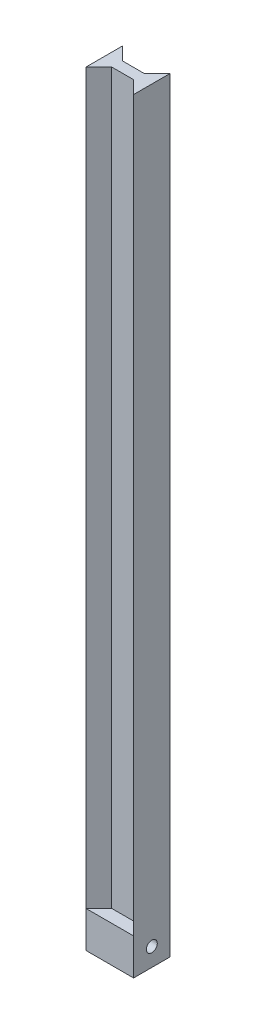
ISO-10303-21;
HEADER;
FILE_DESCRIPTION(('STEP AP214'),'2;1');
FILE_NAME('part.step','',(''),(''),'','','');
FILE_SCHEMA(('AUTOMOTIVE_DESIGN { 1 0 10303 214 1 1 1 1 }'));
ENDSEC;
DATA;
#1=APPLICATION_CONTEXT('core data for automotive mechanical design processes');
#2=APPLICATION_PROTOCOL_DEFINITION('international standard','automotive_design',2000,#1);
#3=PRODUCT_CONTEXT('',#1,'mechanical');
#4=PRODUCT('Part','Part','',(#3));
#5=PRODUCT_RELATED_PRODUCT_CATEGORY('part','',(#4));
#6=PRODUCT_DEFINITION_FORMATION('','',#4);
#7=PRODUCT_DEFINITION_CONTEXT('part definition',#1,'design');
#8=PRODUCT_DEFINITION('design','',#6,#7);
#9=PRODUCT_DEFINITION_SHAPE('','',#8);
#10=(LENGTH_UNIT() NAMED_UNIT(*) SI_UNIT(.MILLI.,.METRE.));
#11=(NAMED_UNIT(*) PLANE_ANGLE_UNIT() SI_UNIT($,.RADIAN.));
#12=(NAMED_UNIT(*) SI_UNIT($,.STERADIAN.) SOLID_ANGLE_UNIT());
#13=UNCERTAINTY_MEASURE_WITH_UNIT(LENGTH_MEASURE(1.E-05),#10,'distance_accuracy_value','');
#14=(GEOMETRIC_REPRESENTATION_CONTEXT(3) GLOBAL_UNCERTAINTY_ASSIGNED_CONTEXT((#13)) GLOBAL_UNIT_ASSIGNED_CONTEXT((#10,
#11,#12)) REPRESENTATION_CONTEXT('',''));
#15=CARTESIAN_POINT('',(0.,0.,0.));
#16=DIRECTION('',(0.,0.,1.));
#17=DIRECTION('',(1.,0.,0.));
#18=AXIS2_PLACEMENT_3D('',#15,#16,#17);
#19=CARTESIAN_POINT('',(0.,200.,9.99999999999999));
#20=DIRECTION('',(-1.,0.,0.));
#21=DIRECTION('',(0.,0.,1.));
#22=AXIS2_PLACEMENT_3D('',#19,#20,#21);
#23=PLANE('',#22);
#24=CARTESIAN_POINT('',(0.,-5.,5.));
#25=DIRECTION('',(-1.,0.,0.));
#26=DIRECTION('',(0.,0.,1.));
#27=AXIS2_PLACEMENT_3D('',#24,#25,#26);
#28=CIRCLE('',#27,1.5);
#29=CARTESIAN_POINT('',(0.,-5.,6.5));
#30=VERTEX_POINT('',#29);
#31=EDGE_CURVE('E242',#30,#30,#28,.T.);
#32=ORIENTED_EDGE('',*,*,#31,.T.);
#33=EDGE_LOOP('',(#32));
#34=FACE_BOUND('',#33,.T.);
#35=DIRECTION('',(0.,-1.,0.));
#36=VECTOR('',#35,1.);
#37=CARTESIAN_POINT('',(0.,200.,9.99999999999999));
#38=LINE('',#37,#36);
#39=CARTESIAN_POINT('',(0.,200.,9.99999999999999));
#40=VERTEX_POINT('',#39);
#41=CARTESIAN_POINT('',(0.,0.,10.));
#42=VERTEX_POINT('',#41);
#43=EDGE_CURVE('E138',#40,#42,#38,.T.);
#44=ORIENTED_EDGE('',*,*,#43,.T.);
#45=DIRECTION('',(0.,1.,0.));
#46=VECTOR('',#45,1.);
#47=CARTESIAN_POINT('',(0.,-10.,10.));
#48=LINE('',#47,#46);
#49=CARTESIAN_POINT('',(0.,-10.,10.));
#50=VERTEX_POINT('',#49);
#51=EDGE_CURVE('E116',#50,#42,#48,.T.);
#52=ORIENTED_EDGE('',*,*,#51,.F.);
#53=DIRECTION('',(0.,0.,1.));
#54=VECTOR('',#53,1.);
#55=CARTESIAN_POINT('',(0.,-10.,0.));
#56=LINE('',#55,#54);
#57=CARTESIAN_POINT('',(0.,-10.,0.));
#58=VERTEX_POINT('',#57);
#59=EDGE_CURVE('E124',#58,#50,#56,.T.);
#60=ORIENTED_EDGE('',*,*,#59,.F.);
#61=DIRECTION('',(0.,1.,0.));
#62=VECTOR('',#61,1.);
#63=CARTESIAN_POINT('',(0.,-10.,0.));
#64=LINE('',#63,#62);
#65=CARTESIAN_POINT('',(0.,0.,0.));
#66=VERTEX_POINT('',#65);
#67=EDGE_CURVE('E230',#58,#66,#64,.T.);
#68=ORIENTED_EDGE('',*,*,#67,.T.);
#69=DIRECTION('',(0.,-1.,0.));
#70=VECTOR('',#69,1.);
#71=CARTESIAN_POINT('',(0.,200.,0.));
#72=LINE('',#71,#70);
#73=CARTESIAN_POINT('',(0.,200.,0.));
#74=VERTEX_POINT('',#73);
#75=EDGE_CURVE('E11',#74,#66,#72,.T.);
#76=ORIENTED_EDGE('',*,*,#75,.F.);
#77=DIRECTION('',(0.,0.,-1.));
#78=VECTOR('',#77,1.);
#79=CARTESIAN_POINT('',(0.,200.,9.99999999999999));
#80=LINE('',#79,#78);
#81=EDGE_CURVE('E151',#40,#74,#80,.T.);
#82=ORIENTED_EDGE('',*,*,#81,.F.);
#83=EDGE_LOOP('',(#44,#52,#60,#68,#76,#82));
#84=FACE_BOUND('',#83,.T.);
#85=ADVANCED_FACE('F38',(#34,#84),#23,.F.);
#86=CARTESIAN_POINT('',(0.,200.,0.));
#87=DIRECTION('',(0.707106781186549,0.,0.707106781186546));
#88=DIRECTION('',(0.707106781186546,0.,-0.707106781186549));
#89=AXIS2_PLACEMENT_3D('',#86,#87,#88);
#90=PLANE('',#89);
#91=DIRECTION('',(-0.707106781186546,0.,0.70710678118655));
#92=VECTOR('',#91,1.);
#93=CARTESIAN_POINT('',(0.,0.,0.));
#94=LINE('',#93,#92);
#95=CARTESIAN_POINT('',(-3.53553390593273,0.,3.53553390593275));
#96=VERTEX_POINT('',#95);
#97=EDGE_CURVE('E140',#66,#96,#94,.T.);
#98=ORIENTED_EDGE('',*,*,#97,.T.);
#99=DIRECTION('',(0.,-1.,0.));
#100=VECTOR('',#99,1.);
#101=CARTESIAN_POINT('',(-3.53553390593273,200.,3.53553390593275));
#102=LINE('',#101,#100);
#103=CARTESIAN_POINT('',(-3.53553390593273,200.,3.53553390593275));
#104=VERTEX_POINT('',#103);
#105=EDGE_CURVE('E47',#104,#96,#102,.T.);
#106=ORIENTED_EDGE('',*,*,#105,.F.);
#107=DIRECTION('',(-0.707106781186546,0.,0.70710678118655));
#108=VECTOR('',#107,1.);
#109=CARTESIAN_POINT('',(0.,200.,0.));
#110=LINE('',#109,#108);
#111=EDGE_CURVE('E154',#74,#104,#110,.T.);
#112=ORIENTED_EDGE('',*,*,#111,.F.);
#113=ORIENTED_EDGE('',*,*,#75,.T.);
#114=EDGE_LOOP('',(#98,#106,#112,#113));
#115=FACE_BOUND('',#114,.T.);
#116=ADVANCED_FACE('F222',(#115),#90,.F.);
#117=CARTESIAN_POINT('',(-3.53553390593273,200.,3.53553390593275));
#118=DIRECTION('',(0.,0.,1.));
#119=DIRECTION('',(1.,0.,0.));
#120=AXIS2_PLACEMENT_3D('',#117,#118,#119);
#121=PLANE('',#120);
#122=DIRECTION('',(-1.,0.,0.));
#123=VECTOR('',#122,1.);
#124=CARTESIAN_POINT('',(-3.53553390593273,0.,3.53553390593275));
#125=LINE('',#124,#123);
#126=CARTESIAN_POINT('',(-9.53553390593273,0.,3.53553390593275));
#127=VERTEX_POINT('',#126);
#128=EDGE_CURVE('E145',#96,#127,#125,.T.);
#129=ORIENTED_EDGE('',*,*,#128,.T.);
#130=DIRECTION('',(0.,-1.,0.));
#131=VECTOR('',#130,1.);
#132=CARTESIAN_POINT('',(-9.53553390593273,200.,3.53553390593275));
#133=LINE('',#132,#131);
#134=CARTESIAN_POINT('',(-9.53553390593273,200.,3.53553390593275));
#135=VERTEX_POINT('',#134);
#136=EDGE_CURVE('E210',#135,#127,#133,.T.);
#137=ORIENTED_EDGE('',*,*,#136,.F.);
#138=DIRECTION('',(-1.,0.,0.));
#139=VECTOR('',#138,1.);
#140=CARTESIAN_POINT('',(-3.53553390593273,200.,3.53553390593275));
#141=LINE('',#140,#139);
#142=EDGE_CURVE('E158',#104,#135,#141,.T.);
#143=ORIENTED_EDGE('',*,*,#142,.F.);
#144=ORIENTED_EDGE('',*,*,#105,.T.);
#145=EDGE_LOOP('',(#129,#137,#143,#144));
#146=FACE_BOUND('',#145,.T.);
#147=ADVANCED_FACE('F218',(#146),#121,.F.);
#148=CARTESIAN_POINT('',(-9.53553390593273,200.,3.53553390593275));
#149=DIRECTION('',(-0.707106781186547,0.,0.707106781186548));
#150=DIRECTION('',(0.707106781186548,0.,0.707106781186547));
#151=AXIS2_PLACEMENT_3D('',#148,#149,#150);
#152=PLANE('',#151);
#153=DIRECTION('',(-0.707106781186548,0.,-0.707106781186547));
#154=VECTOR('',#153,1.);
#155=CARTESIAN_POINT('',(-9.53553390593273,0.,3.53553390593275));
#156=LINE('',#155,#154);
#157=CARTESIAN_POINT('',(-13.0710678118655,0.,0.));
#158=VERTEX_POINT('',#157);
#159=EDGE_CURVE('E178',#127,#158,#156,.T.);
#160=ORIENTED_EDGE('',*,*,#159,.T.);
#161=DIRECTION('',(0.,-1.,0.));
#162=VECTOR('',#161,1.);
#163=CARTESIAN_POINT('',(-13.0710678118655,200.,0.));
#164=LINE('',#163,#162);
#165=CARTESIAN_POINT('',(-13.0710678118655,200.,0.));
#166=VERTEX_POINT('',#165);
#167=EDGE_CURVE('E206',#166,#158,#164,.T.);
#168=ORIENTED_EDGE('',*,*,#167,.F.);
#169=DIRECTION('',(-0.707106781186548,0.,-0.707106781186547));
#170=VECTOR('',#169,1.);
#171=CARTESIAN_POINT('',(-9.53553390593273,200.,3.53553390593275));
#172=LINE('',#171,#170);
#173=EDGE_CURVE('E161',#135,#166,#172,.T.);
#174=ORIENTED_EDGE('',*,*,#173,.F.);
#175=ORIENTED_EDGE('',*,*,#136,.T.);
#176=EDGE_LOOP('',(#160,#168,#174,#175));
#177=FACE_BOUND('',#176,.T.);
#178=ADVANCED_FACE('F261',(#177),#152,.F.);
#179=CARTESIAN_POINT('',(-13.0710678118655,200.,0.));
#180=DIRECTION('',(1.,0.,0.));
#181=DIRECTION('',(0.,0.,-1.));
#182=AXIS2_PLACEMENT_3D('',#179,#180,#181);
#183=PLANE('',#182);
#184=CARTESIAN_POINT('',(-13.0710678118655,-5.,5.00000000000001));
#185=DIRECTION('',(-1.,0.,0.));
#186=DIRECTION('',(0.,0.,1.));
#187=AXIS2_PLACEMENT_3D('',#184,#185,#186);
#188=CIRCLE('',#187,1.5);
#189=CARTESIAN_POINT('',(-13.0710678118655,-5.,6.50000000000001));
#190=VERTEX_POINT('',#189);
#191=EDGE_CURVE('E249',#190,#190,#188,.T.);
#192=ORIENTED_EDGE('',*,*,#191,.F.);
#193=EDGE_LOOP('',(#192));
#194=FACE_BOUND('',#193,.T.);
#195=ORIENTED_EDGE('',*,*,#167,.T.);
#196=DIRECTION('',(0.,1.,0.));
#197=VECTOR('',#196,1.);
#198=CARTESIAN_POINT('',(-13.0710678118655,-10.,0.));
#199=LINE('',#198,#197);
#200=CARTESIAN_POINT('',(-13.0710678118655,-10.,0.));
#201=VERTEX_POINT('',#200);
#202=EDGE_CURVE('E147',#201,#158,#199,.T.);
#203=ORIENTED_EDGE('',*,*,#202,.F.);
#204=DIRECTION('',(0.,0.,-1.));
#205=VECTOR('',#204,1.);
#206=CARTESIAN_POINT('',(-13.0710678118655,-10.,0.));
#207=LINE('',#206,#205);
#208=CARTESIAN_POINT('',(-13.0710678118655,-10.,10.));
#209=VERTEX_POINT('',#208);
#210=EDGE_CURVE('E123',#209,#201,#207,.T.);
#211=ORIENTED_EDGE('',*,*,#210,.F.);
#212=DIRECTION('',(0.,1.,0.));
#213=VECTOR('',#212,1.);
#214=CARTESIAN_POINT('',(-13.0710678118655,-10.,10.));
#215=LINE('',#214,#213);
#216=CARTESIAN_POINT('',(-13.0710678118655,0.,10.));
#217=VERTEX_POINT('',#216);
#218=EDGE_CURVE('E119',#209,#217,#215,.T.);
#219=ORIENTED_EDGE('',*,*,#218,.T.);
#220=DIRECTION('',(0.,-1.,0.));
#221=VECTOR('',#220,1.);
#222=CARTESIAN_POINT('',(-13.0710678118655,200.,10.));
#223=LINE('',#222,#221);
#224=CARTESIAN_POINT('',(-13.0710678118655,200.,10.));
#225=VERTEX_POINT('',#224);
#226=EDGE_CURVE('E202',#225,#217,#223,.T.);
#227=ORIENTED_EDGE('',*,*,#226,.F.);
#228=DIRECTION('',(0.,0.,1.));
#229=VECTOR('',#228,1.);
#230=CARTESIAN_POINT('',(-13.0710678118655,200.,0.));
#231=LINE('',#230,#229);
#232=EDGE_CURVE('E164',#166,#225,#231,.T.);
#233=ORIENTED_EDGE('',*,*,#232,.F.);
#234=EDGE_LOOP('',(#195,#203,#211,#219,#227,#233));
#235=FACE_BOUND('',#234,.T.);
#236=ADVANCED_FACE('F257',(#194,#235),#183,.F.);
#237=CARTESIAN_POINT('',(-13.0710678118655,200.,10.));
#238=DIRECTION('',(-0.707106781186549,0.,-0.707106781186546));
#239=DIRECTION('',(-0.707106781186546,0.,0.707106781186549));
#240=AXIS2_PLACEMENT_3D('',#237,#238,#239);
#241=PLANE('',#240);
#242=DIRECTION('',(0.707106781186546,0.,-0.707106781186549));
#243=VECTOR('',#242,1.);
#244=CARTESIAN_POINT('',(-13.0710678118655,0.,10.));
#245=LINE('',#244,#243);
#246=CARTESIAN_POINT('',(-9.53553390593273,0.,6.46446609406726));
#247=VERTEX_POINT('',#246);
#248=EDGE_CURVE('E182',#217,#247,#245,.T.);
#249=ORIENTED_EDGE('',*,*,#248,.T.);
#250=DIRECTION('',(0.,-1.,0.));
#251=VECTOR('',#250,1.);
#252=CARTESIAN_POINT('',(-9.53553390593273,200.,6.46446609406726));
#253=LINE('',#252,#251);
#254=CARTESIAN_POINT('',(-9.53553390593273,200.,6.46446609406726));
#255=VERTEX_POINT('',#254);
#256=EDGE_CURVE('E198',#255,#247,#253,.T.);
#257=ORIENTED_EDGE('',*,*,#256,.F.);
#258=DIRECTION('',(0.707106781186546,0.,-0.707106781186549));
#259=VECTOR('',#258,1.);
#260=CARTESIAN_POINT('',(-13.0710678118655,200.,10.));
#261=LINE('',#260,#259);
#262=EDGE_CURVE('E167',#225,#255,#261,.T.);
#263=ORIENTED_EDGE('',*,*,#262,.F.);
#264=ORIENTED_EDGE('',*,*,#226,.T.);
#265=EDGE_LOOP('',(#249,#257,#263,#264));
#266=FACE_BOUND('',#265,.T.);
#267=ADVANCED_FACE('F260',(#266),#241,.F.);
#268=CARTESIAN_POINT('',(-9.53553390593273,200.,6.46446609406726));
#269=DIRECTION('',(0.,0.,-1.));
#270=DIRECTION('',(-1.,0.,0.));
#271=AXIS2_PLACEMENT_3D('',#268,#269,#270);
#272=PLANE('',#271);
#273=DIRECTION('',(1.,0.,0.));
#274=VECTOR('',#273,1.);
#275=CARTESIAN_POINT('',(-9.53553390593273,0.,6.46446609406726));
#276=LINE('',#275,#274);
#277=CARTESIAN_POINT('',(-3.53553390593273,0.,6.46446609406725));
#278=VERTEX_POINT('',#277);
#279=EDGE_CURVE('E186',#247,#278,#276,.T.);
#280=ORIENTED_EDGE('',*,*,#279,.T.);
#281=DIRECTION('',(0.,-1.,0.));
#282=VECTOR('',#281,1.);
#283=CARTESIAN_POINT('',(-3.53553390593273,200.,6.46446609406725));
#284=LINE('',#283,#282);
#285=CARTESIAN_POINT('',(-3.53553390593273,200.,6.46446609406725));
#286=VERTEX_POINT('',#285);
#287=EDGE_CURVE('E194',#286,#278,#284,.T.);
#288=ORIENTED_EDGE('',*,*,#287,.F.);
#289=DIRECTION('',(1.,0.,0.));
#290=VECTOR('',#289,1.);
#291=CARTESIAN_POINT('',(-9.53553390593273,200.,6.46446609406726));
#292=LINE('',#291,#290);
#293=EDGE_CURVE('E170',#255,#286,#292,.T.);
#294=ORIENTED_EDGE('',*,*,#293,.F.);
#295=ORIENTED_EDGE('',*,*,#256,.T.);
#296=EDGE_LOOP('',(#280,#288,#294,#295));
#297=FACE_BOUND('',#296,.T.);
#298=ADVANCED_FACE('F275',(#297),#272,.F.);
#299=CARTESIAN_POINT('',(-3.53553390593273,200.,6.46446609406725));
#300=DIRECTION('',(0.707106781186547,0.,-0.707106781186548));
#301=DIRECTION('',(-0.707106781186548,0.,-0.707106781186547));
#302=AXIS2_PLACEMENT_3D('',#299,#300,#301);
#303=PLANE('',#302);
#304=DIRECTION('',(0.707106781186548,0.,0.707106781186547));
#305=VECTOR('',#304,1.);
#306=CARTESIAN_POINT('',(-3.53553390593273,0.,6.46446609406725));
#307=LINE('',#306,#305);
#308=EDGE_CURVE('E155',#278,#42,#307,.T.);
#309=ORIENTED_EDGE('',*,*,#308,.T.);
#310=ORIENTED_EDGE('',*,*,#43,.F.);
#311=DIRECTION('',(0.707106781186548,0.,0.707106781186547));
#312=VECTOR('',#311,1.);
#313=CARTESIAN_POINT('',(-3.53553390593273,200.,6.46446609406725));
#314=LINE('',#313,#312);
#315=EDGE_CURVE('E54',#286,#40,#314,.T.);
#316=ORIENTED_EDGE('',*,*,#315,.F.);
#317=ORIENTED_EDGE('',*,*,#287,.T.);
#318=EDGE_LOOP('',(#309,#310,#316,#317));
#319=FACE_BOUND('',#318,.T.);
#320=ADVANCED_FACE('F277',(#319),#303,.F.);
#321=CARTESIAN_POINT('',(0.,200.,0.));
#322=DIRECTION('',(0.,1.,0.));
#323=DIRECTION('',(0.,0.,1.));
#324=AXIS2_PLACEMENT_3D('',#321,#322,#323);
#325=PLANE('',#324);
#326=ORIENTED_EDGE('',*,*,#81,.T.);
#327=ORIENTED_EDGE('',*,*,#111,.T.);
#328=ORIENTED_EDGE('',*,*,#142,.T.);
#329=ORIENTED_EDGE('',*,*,#173,.T.);
#330=ORIENTED_EDGE('',*,*,#232,.T.);
#331=ORIENTED_EDGE('',*,*,#262,.T.);
#332=ORIENTED_EDGE('',*,*,#293,.T.);
#333=ORIENTED_EDGE('',*,*,#315,.T.);
#334=EDGE_LOOP('',(#326,#327,#328,#329,#330,#331,#332,#333));
#335=FACE_BOUND('',#334,.T.);
#336=ADVANCED_FACE('F268',(#335),#325,.T.);
#337=CARTESIAN_POINT('',(0.,0.,0.));
#338=DIRECTION('',(0.,-1.,0.));
#339=DIRECTION('',(0.,0.,-1.));
#340=AXIS2_PLACEMENT_3D('',#337,#338,#339);
#341=PLANE('',#340);
#342=ORIENTED_EDGE('',*,*,#308,.F.);
#343=ORIENTED_EDGE('',*,*,#279,.F.);
#344=ORIENTED_EDGE('',*,*,#248,.F.);
#345=DIRECTION('',(-1.,0.,0.));
#346=VECTOR('',#345,1.);
#347=CARTESIAN_POINT('',(0.,0.,10.));
#348=LINE('',#347,#346);
#349=EDGE_CURVE('E233',#42,#217,#348,.T.);
#350=ORIENTED_EDGE('',*,*,#349,.F.);
#351=EDGE_LOOP('',(#342,#343,#344,#350));
#352=FACE_BOUND('',#351,.T.);
#353=ADVANCED_FACE('F279',(#352),#341,.F.);
#354=CARTESIAN_POINT('',(0.,-10.,10.));
#355=DIRECTION('',(0.,0.,-1.));
#356=DIRECTION('',(-1.,0.,0.));
#357=AXIS2_PLACEMENT_3D('',#354,#355,#356);
#358=PLANE('',#357);
#359=ORIENTED_EDGE('',*,*,#349,.T.);
#360=ORIENTED_EDGE('',*,*,#218,.F.);
#361=DIRECTION('',(-1.,0.,0.));
#362=VECTOR('',#361,1.);
#363=CARTESIAN_POINT('',(0.,-10.,10.));
#364=LINE('',#363,#362);
#365=EDGE_CURVE('E111',#50,#209,#364,.T.);
#366=ORIENTED_EDGE('',*,*,#365,.F.);
#367=ORIENTED_EDGE('',*,*,#51,.T.);
#368=EDGE_LOOP('',(#359,#360,#366,#367));
#369=FACE_BOUND('',#368,.T.);
#370=ADVANCED_FACE('F114',(#369),#358,.F.);
#371=CARTESIAN_POINT('',(0.,-10.,0.));
#372=DIRECTION('',(0.,0.,1.));
#373=DIRECTION('',(1.,0.,0.));
#374=AXIS2_PLACEMENT_3D('',#371,#372,#373);
#375=PLANE('',#374);
#376=DIRECTION('',(1.,0.,0.));
#377=VECTOR('',#376,1.);
#378=CARTESIAN_POINT('',(0.,0.,0.));
#379=LINE('',#378,#377);
#380=EDGE_CURVE('E134',#158,#66,#379,.T.);
#381=ORIENTED_EDGE('',*,*,#380,.T.);
#382=ORIENTED_EDGE('',*,*,#67,.F.);
#383=DIRECTION('',(1.,0.,0.));
#384=VECTOR('',#383,1.);
#385=CARTESIAN_POINT('',(0.,-10.,0.));
#386=LINE('',#385,#384);
#387=EDGE_CURVE('E129',#201,#58,#386,.T.);
#388=ORIENTED_EDGE('',*,*,#387,.F.);
#389=ORIENTED_EDGE('',*,*,#202,.T.);
#390=EDGE_LOOP('',(#381,#382,#388,#389));
#391=FACE_BOUND('',#390,.T.);
#392=ADVANCED_FACE('F229',(#391),#375,.F.);
#393=CARTESIAN_POINT('',(0.,-10.,0.));
#394=DIRECTION('',(0.,-1.,0.));
#395=DIRECTION('',(0.,0.,-1.));
#396=AXIS2_PLACEMENT_3D('',#393,#394,#395);
#397=PLANE('',#396);
#398=ORIENTED_EDGE('',*,*,#59,.T.);
#399=ORIENTED_EDGE('',*,*,#365,.T.);
#400=ORIENTED_EDGE('',*,*,#210,.T.);
#401=ORIENTED_EDGE('',*,*,#387,.T.);
#402=EDGE_LOOP('',(#398,#399,#400,#401));
#403=FACE_BOUND('',#402,.T.);
#404=ADVANCED_FACE('F127',(#403),#397,.T.);
#405=ORIENTED_EDGE('',*,*,#159,.F.);
#406=ORIENTED_EDGE('',*,*,#128,.F.);
#407=ORIENTED_EDGE('',*,*,#97,.F.);
#408=ORIENTED_EDGE('',*,*,#380,.F.);
#409=EDGE_LOOP('',(#405,#406,#407,#408));
#410=FACE_BOUND('',#409,.T.);
#411=ADVANCED_FACE('F227',(#410),#341,.F.);
#412=CARTESIAN_POINT('',(16.9289321881345,-5.,5.));
#413=DIRECTION('',(-1.,0.,0.));
#414=DIRECTION('',(0.,0.,1.));
#415=AXIS2_PLACEMENT_3D('',#412,#413,#414);
#416=CYLINDRICAL_SURFACE('',#415,1.5);
#417=ORIENTED_EDGE('',*,*,#191,.T.);
#418=EDGE_LOOP('',(#417));
#419=FACE_BOUND('',#418,.T.);
#420=ORIENTED_EDGE('',*,*,#31,.F.);
#421=EDGE_LOOP('',(#420));
#422=FACE_BOUND('',#421,.T.);
#423=ADVANCED_FACE('F254',(#419,#422),#416,.F.);
#424=CLOSED_SHELL('',(#85,#116,#147,#178,#236,#267,#298,#320,#336,#353,#370,#392,#404,#411,#423));
#425=MANIFOLD_SOLID_BREP('B2',#424);
#426=ADVANCED_BREP_SHAPE_REPRESENTATION('',(#18,#425),#14);
#427=SHAPE_DEFINITION_REPRESENTATION(#9,#426);
ENDSEC;
END-ISO-10303-21;
